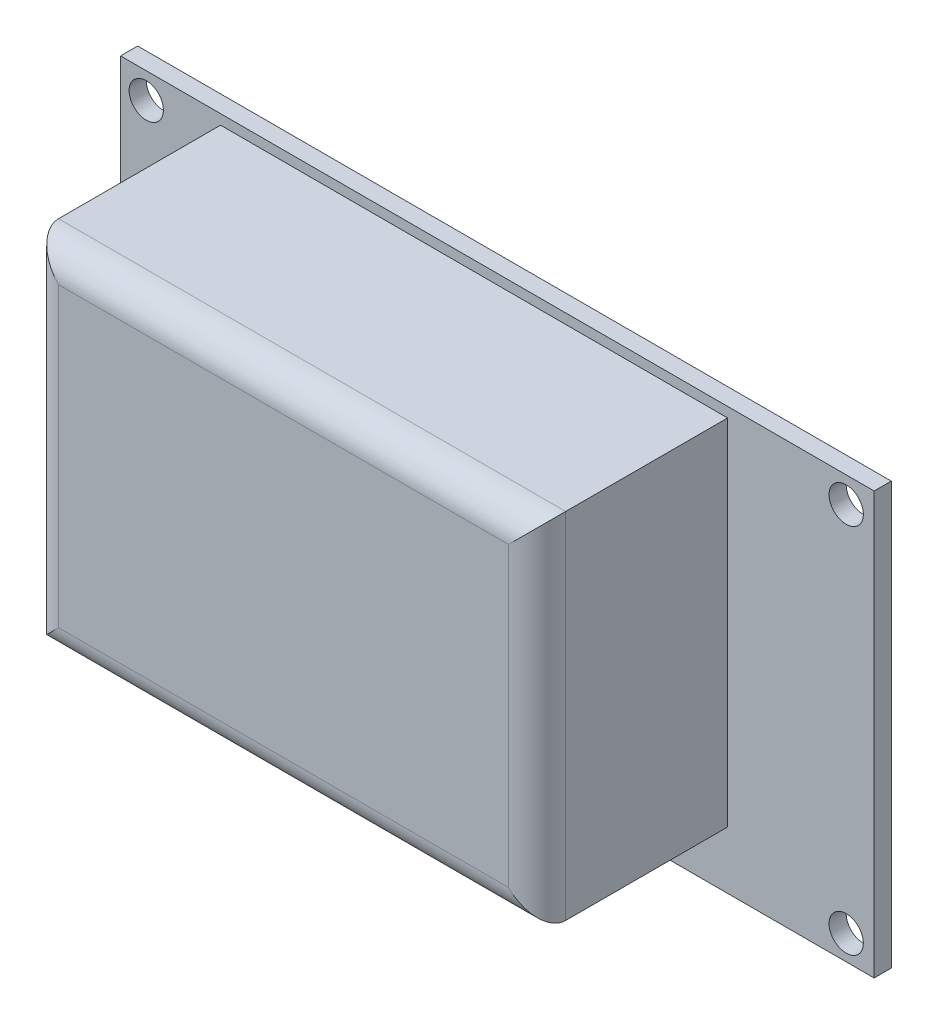
ISO-10303-21;
HEADER;
FILE_DESCRIPTION(('STEP AP214'),'2;1');
FILE_NAME('part.step','',(''),(''),'','','');
FILE_SCHEMA(('AUTOMOTIVE_DESIGN { 1 0 10303 214 1 1 1 1 }'));
ENDSEC;
DATA;
#1=APPLICATION_CONTEXT('core data for automotive mechanical design processes');
#2=APPLICATION_PROTOCOL_DEFINITION('international standard','automotive_design',2000,#1);
#3=PRODUCT_CONTEXT('',#1,'mechanical');
#4=PRODUCT('Part','Part','',(#3));
#5=PRODUCT_RELATED_PRODUCT_CATEGORY('part','',(#4));
#6=PRODUCT_DEFINITION_FORMATION('','',#4);
#7=PRODUCT_DEFINITION_CONTEXT('part definition',#1,'design');
#8=PRODUCT_DEFINITION('design','',#6,#7);
#9=PRODUCT_DEFINITION_SHAPE('','',#8);
#10=(LENGTH_UNIT() NAMED_UNIT(*) SI_UNIT(.MILLI.,.METRE.));
#11=(NAMED_UNIT(*) PLANE_ANGLE_UNIT() SI_UNIT($,.RADIAN.));
#12=(NAMED_UNIT(*) SI_UNIT($,.STERADIAN.) SOLID_ANGLE_UNIT());
#13=UNCERTAINTY_MEASURE_WITH_UNIT(LENGTH_MEASURE(1.E-05),#10,'distance_accuracy_value','');
#14=(GEOMETRIC_REPRESENTATION_CONTEXT(3) GLOBAL_UNCERTAINTY_ASSIGNED_CONTEXT((#13)) GLOBAL_UNIT_ASSIGNED_CONTEXT((#10,
#11,#12)) REPRESENTATION_CONTEXT('',''));
#15=CARTESIAN_POINT('',(0.,0.,0.));
#16=DIRECTION('',(0.,0.,1.));
#17=DIRECTION('',(1.,0.,0.));
#18=AXIS2_PLACEMENT_3D('',#15,#16,#17);
#19=CARTESIAN_POINT('',(-33.5000000052,18.749999965,1.524));
#20=DIRECTION('',(0.,0.,-1.));
#21=DIRECTION('',(-1.,0.,0.));
#22=AXIS2_PLACEMENT_3D('',#19,#20,#21);
#23=PLANE('',#22);
#24=CARTESIAN_POINT('',(-31.2140000052,16.463999965,1.524));
#25=DIRECTION('',(0.,0.,-1.));
#26=DIRECTION('',(-1.,0.,0.));
#27=AXIS2_PLACEMENT_3D('',#24,#25,#26);
#28=CIRCLE('',#27,1.52400000000001);
#29=CARTESIAN_POINT('',(-32.7380000052,16.463999965,1.524));
#30=VERTEX_POINT('',#29);
#31=EDGE_CURVE('E198',#30,#30,#28,.T.);
#32=ORIENTED_EDGE('',*,*,#31,.T.);
#33=EDGE_LOOP('',(#32));
#34=FACE_BOUND('',#33,.T.);
#35=CARTESIAN_POINT('',(31.0159999948,16.463999965,1.524));
#36=DIRECTION('',(0.,0.,-1.));
#37=DIRECTION('',(-1.,0.,0.));
#38=AXIS2_PLACEMENT_3D('',#35,#36,#37);
#39=CIRCLE('',#38,1.52400000000001);
#40=CARTESIAN_POINT('',(29.4919999948,16.463999965,1.524));
#41=VERTEX_POINT('',#40);
#42=EDGE_CURVE('E208',#41,#41,#39,.T.);
#43=ORIENTED_EDGE('',*,*,#42,.T.);
#44=EDGE_LOOP('',(#43));
#45=FACE_BOUND('',#44,.T.);
#46=CARTESIAN_POINT('',(-31.2140000052,-16.556000035,1.524));
#47=DIRECTION('',(0.,0.,-1.));
#48=DIRECTION('',(-1.,0.,0.));
#49=AXIS2_PLACEMENT_3D('',#46,#47,#48);
#50=CIRCLE('',#49,1.52400000000001);
#51=CARTESIAN_POINT('',(-32.7380000052,-16.556000035,1.524));
#52=VERTEX_POINT('',#51);
#53=EDGE_CURVE('E214',#52,#52,#50,.T.);
#54=ORIENTED_EDGE('',*,*,#53,.T.);
#55=EDGE_LOOP('',(#54));
#56=FACE_BOUND('',#55,.T.);
#57=CARTESIAN_POINT('',(31.0159999948,-16.556000035,1.524));
#58=DIRECTION('',(0.,0.,1.));
#59=DIRECTION('',(1.,0.,0.));
#60=AXIS2_PLACEMENT_3D('',#57,#58,#59);
#61=CIRCLE('',#60,1.52400000000001);
#62=CARTESIAN_POINT('',(32.5399999948,-16.556000035,1.524));
#63=VERTEX_POINT('',#62);
#64=EDGE_CURVE('E217',#63,#63,#61,.T.);
#65=ORIENTED_EDGE('',*,*,#64,.F.);
#66=EDGE_LOOP('',(#65));
#67=FACE_BOUND('',#66,.T.);
#68=DIRECTION('',(0.,1.,0.));
#69=VECTOR('',#68,1.);
#70=CARTESIAN_POINT('',(-33.5000000052,-18.749999965,1.524));
#71=LINE('',#70,#69);
#72=CARTESIAN_POINT('',(-33.5000000052,-18.749999965,1.524));
#73=VERTEX_POINT('',#72);
#74=CARTESIAN_POINT('',(-33.5000000052,18.749999965,1.524));
#75=VERTEX_POINT('',#74);
#76=EDGE_CURVE('E138',#73,#75,#71,.T.);
#77=ORIENTED_EDGE('',*,*,#76,.F.);
#78=DIRECTION('',(-1.,0.,0.));
#79=VECTOR('',#78,1.);
#80=CARTESIAN_POINT('',(33.5000000052,-18.749999965,1.524));
#81=LINE('',#80,#79);
#82=CARTESIAN_POINT('',(33.5000000052,-18.749999965,1.524));
#83=VERTEX_POINT('',#82);
#84=EDGE_CURVE('E148',#83,#73,#81,.T.);
#85=ORIENTED_EDGE('',*,*,#84,.F.);
#86=DIRECTION('',(0.,-1.,0.));
#87=VECTOR('',#86,1.);
#88=CARTESIAN_POINT('',(33.5000000052,18.749999965,1.524));
#89=LINE('',#88,#87);
#90=CARTESIAN_POINT('',(33.5000000052,18.749999965,1.524));
#91=VERTEX_POINT('',#90);
#92=EDGE_CURVE('E145',#91,#83,#89,.T.);
#93=ORIENTED_EDGE('',*,*,#92,.F.);
#94=DIRECTION('',(1.,0.,0.));
#95=VECTOR('',#94,1.);
#96=CARTESIAN_POINT('',(-33.5000000052,18.749999965,1.524));
#97=LINE('',#96,#95);
#98=EDGE_CURVE('E141',#75,#91,#97,.T.);
#99=ORIENTED_EDGE('',*,*,#98,.F.);
#100=EDGE_LOOP('',(#77,#85,#93,#99));
#101=FACE_BOUND('',#100,.T.);
#102=DIRECTION('',(0.,1.,0.));
#103=VECTOR('',#102,1.);
#104=CARTESIAN_POINT('',(20.4749999981446,17.8609999622899,1.524));
#105=LINE('',#104,#103);
#106=CARTESIAN_POINT('',(20.4749999981446,-13.635000038637,1.524));
#107=VERTEX_POINT('',#106);
#108=CARTESIAN_POINT('',(20.4749999981446,17.8609999622899,1.524));
#109=VERTEX_POINT('',#108);
#110=EDGE_CURVE('E109',#107,#109,#105,.T.);
#111=ORIENTED_EDGE('',*,*,#110,.F.);
#112=DIRECTION('',(1.,0.,0.));
#113=VECTOR('',#112,1.);
#114=CARTESIAN_POINT('',(20.4749999981446,-13.635000038637,1.524));
#115=LINE('',#114,#113);
#116=CARTESIAN_POINT('',(-24.610000007605,-13.635000038637,1.524));
#117=VERTEX_POINT('',#116);
#118=EDGE_CURVE('E114',#117,#107,#115,.T.);
#119=ORIENTED_EDGE('',*,*,#118,.F.);
#120=DIRECTION('',(0.,-1.,0.));
#121=VECTOR('',#120,1.);
#122=CARTESIAN_POINT('',(-24.610000007605,-13.635000038637,1.524));
#123=LINE('',#122,#121);
#124=CARTESIAN_POINT('',(-24.610000007605,17.8609999622899,1.524));
#125=VERTEX_POINT('',#124);
#126=EDGE_CURVE('E127',#125,#117,#123,.T.);
#127=ORIENTED_EDGE('',*,*,#126,.F.);
#128=DIRECTION('',(-1.,0.,0.));
#129=VECTOR('',#128,1.);
#130=CARTESIAN_POINT('',(-24.610000007605,17.8609999622899,1.524));
#131=LINE('',#130,#129);
#132=EDGE_CURVE('E122',#109,#125,#131,.T.);
#133=ORIENTED_EDGE('',*,*,#132,.F.);
#134=EDGE_LOOP('',(#111,#119,#127,#133));
#135=FACE_BOUND('',#134,.T.);
#136=ADVANCED_FACE('F31',(#34,#45,#56,#67,#101,#135),#23,.F.);
#137=CARTESIAN_POINT('',(-33.5000000052,-18.749999965,1.524));
#138=DIRECTION('',(-1.,0.,0.));
#139=DIRECTION('',(0.,0.,1.));
#140=AXIS2_PLACEMENT_3D('',#137,#138,#139);
#141=PLANE('',#140);
#142=DIRECTION('',(0.,1.,0.));
#143=VECTOR('',#142,1.);
#144=CARTESIAN_POINT('',(-33.5000000052,-18.749999965,0.));
#145=LINE('',#144,#143);
#146=CARTESIAN_POINT('',(-33.5000000052,-18.749999965,0.));
#147=VERTEX_POINT('',#146);
#148=CARTESIAN_POINT('',(-33.5000000052,18.749999965,0.));
#149=VERTEX_POINT('',#148);
#150=EDGE_CURVE('E137',#147,#149,#145,.T.);
#151=ORIENTED_EDGE('',*,*,#150,.F.);
#152=DIRECTION('',(0.,0.,-1.));
#153=VECTOR('',#152,1.);
#154=CARTESIAN_POINT('',(-33.5000000052,-18.749999965,1.524));
#155=LINE('',#154,#153);
#156=EDGE_CURVE('E162',#73,#147,#155,.T.);
#157=ORIENTED_EDGE('',*,*,#156,.F.);
#158=ORIENTED_EDGE('',*,*,#76,.T.);
#159=DIRECTION('',(0.,0.,-1.));
#160=VECTOR('',#159,1.);
#161=CARTESIAN_POINT('',(-33.5000000052,18.749999965,1.524));
#162=LINE('',#161,#160);
#163=EDGE_CURVE('E151',#75,#149,#162,.T.);
#164=ORIENTED_EDGE('',*,*,#163,.T.);
#165=EDGE_LOOP('',(#151,#157,#158,#164));
#166=FACE_BOUND('',#165,.T.);
#167=ADVANCED_FACE('F242',(#166),#141,.T.);
#168=CARTESIAN_POINT('',(33.5000000052,-18.749999965,1.524));
#169=DIRECTION('',(0.,-1.,0.));
#170=DIRECTION('',(0.,0.,-1.));
#171=AXIS2_PLACEMENT_3D('',#168,#169,#170);
#172=PLANE('',#171);
#173=DIRECTION('',(-1.,0.,0.));
#174=VECTOR('',#173,1.);
#175=CARTESIAN_POINT('',(33.5000000052,-18.749999965,0.));
#176=LINE('',#175,#174);
#177=CARTESIAN_POINT('',(33.5000000052,-18.749999965,0.));
#178=VERTEX_POINT('',#177);
#179=EDGE_CURVE('E142',#178,#147,#176,.T.);
#180=ORIENTED_EDGE('',*,*,#179,.F.);
#181=DIRECTION('',(0.,0.,-1.));
#182=VECTOR('',#181,1.);
#183=CARTESIAN_POINT('',(33.5000000052,-18.749999965,1.524));
#184=LINE('',#183,#182);
#185=EDGE_CURVE('E165',#83,#178,#184,.T.);
#186=ORIENTED_EDGE('',*,*,#185,.F.);
#187=ORIENTED_EDGE('',*,*,#84,.T.);
#188=ORIENTED_EDGE('',*,*,#156,.T.);
#189=EDGE_LOOP('',(#180,#186,#187,#188));
#190=FACE_BOUND('',#189,.T.);
#191=ADVANCED_FACE('F248',(#190),#172,.T.);
#192=CARTESIAN_POINT('',(33.5000000052,18.749999965,1.524));
#193=DIRECTION('',(1.,0.,0.));
#194=DIRECTION('',(0.,0.,-1.));
#195=AXIS2_PLACEMENT_3D('',#192,#193,#194);
#196=PLANE('',#195);
#197=DIRECTION('',(0.,-1.,0.));
#198=VECTOR('',#197,1.);
#199=CARTESIAN_POINT('',(33.5000000052,18.749999965,0.));
#200=LINE('',#199,#198);
#201=CARTESIAN_POINT('',(33.5000000052,18.749999965,0.));
#202=VERTEX_POINT('',#201);
#203=EDGE_CURVE('E157',#202,#178,#200,.T.);
#204=ORIENTED_EDGE('',*,*,#203,.F.);
#205=DIRECTION('',(0.,0.,-1.));
#206=VECTOR('',#205,1.);
#207=CARTESIAN_POINT('',(33.5000000052,18.749999965,1.524));
#208=LINE('',#207,#206);
#209=EDGE_CURVE('E167',#91,#202,#208,.T.);
#210=ORIENTED_EDGE('',*,*,#209,.F.);
#211=ORIENTED_EDGE('',*,*,#92,.T.);
#212=ORIENTED_EDGE('',*,*,#185,.T.);
#213=EDGE_LOOP('',(#204,#210,#211,#212));
#214=FACE_BOUND('',#213,.T.);
#215=ADVANCED_FACE('F262',(#214),#196,.T.);
#216=CARTESIAN_POINT('',(-33.5000000052,18.749999965,1.524));
#217=DIRECTION('',(0.,1.,0.));
#218=DIRECTION('',(0.,0.,1.));
#219=AXIS2_PLACEMENT_3D('',#216,#217,#218);
#220=PLANE('',#219);
#221=DIRECTION('',(1.,0.,0.));
#222=VECTOR('',#221,1.);
#223=CARTESIAN_POINT('',(-33.5000000052,18.749999965,0.));
#224=LINE('',#223,#222);
#225=EDGE_CURVE('E154',#149,#202,#224,.T.);
#226=ORIENTED_EDGE('',*,*,#225,.F.);
#227=ORIENTED_EDGE('',*,*,#163,.F.);
#228=ORIENTED_EDGE('',*,*,#98,.T.);
#229=ORIENTED_EDGE('',*,*,#209,.T.);
#230=EDGE_LOOP('',(#226,#227,#228,#229));
#231=FACE_BOUND('',#230,.T.);
#232=ADVANCED_FACE('F258',(#231),#220,.T.);
#233=CARTESIAN_POINT('',(-33.5000000052,18.749999965,0.));
#234=DIRECTION('',(0.,0.,-1.));
#235=DIRECTION('',(-1.,0.,0.));
#236=AXIS2_PLACEMENT_3D('',#233,#234,#235);
#237=PLANE('',#236);
#238=CARTESIAN_POINT('',(-31.2140000052,16.463999965,0.));
#239=DIRECTION('',(0.,0.,-1.));
#240=DIRECTION('',(-1.,0.,0.));
#241=AXIS2_PLACEMENT_3D('',#238,#239,#240);
#242=CIRCLE('',#241,1.52400000000001);
#243=CARTESIAN_POINT('',(-32.7380000052,16.463999965,0.));
#244=VERTEX_POINT('',#243);
#245=EDGE_CURVE('E193',#244,#244,#242,.T.);
#246=ORIENTED_EDGE('',*,*,#245,.F.);
#247=EDGE_LOOP('',(#246));
#248=FACE_BOUND('',#247,.T.);
#249=CARTESIAN_POINT('',(31.0159999948,16.463999965,0.));
#250=DIRECTION('',(0.,0.,-1.));
#251=DIRECTION('',(-1.,0.,0.));
#252=AXIS2_PLACEMENT_3D('',#249,#250,#251);
#253=CIRCLE('',#252,1.52400000000001);
#254=CARTESIAN_POINT('',(29.4919999948,16.463999965,0.));
#255=VERTEX_POINT('',#254);
#256=EDGE_CURVE('E203',#255,#255,#253,.T.);
#257=ORIENTED_EDGE('',*,*,#256,.F.);
#258=EDGE_LOOP('',(#257));
#259=FACE_BOUND('',#258,.T.);
#260=CARTESIAN_POINT('',(-31.2140000052,-16.556000035,0.));
#261=DIRECTION('',(0.,0.,-1.));
#262=DIRECTION('',(-1.,0.,0.));
#263=AXIS2_PLACEMENT_3D('',#260,#261,#262);
#264=CIRCLE('',#263,1.52400000000001);
#265=CARTESIAN_POINT('',(-32.7380000052,-16.556000035,0.));
#266=VERTEX_POINT('',#265);
#267=EDGE_CURVE('E211',#266,#266,#264,.T.);
#268=ORIENTED_EDGE('',*,*,#267,.F.);
#269=EDGE_LOOP('',(#268));
#270=FACE_BOUND('',#269,.T.);
#271=CARTESIAN_POINT('',(31.0159999948,-16.556000035,0.));
#272=DIRECTION('',(0.,0.,1.));
#273=DIRECTION('',(1.,0.,0.));
#274=AXIS2_PLACEMENT_3D('',#271,#272,#273);
#275=CIRCLE('',#274,1.52400000000001);
#276=CARTESIAN_POINT('',(32.5399999948,-16.556000035,0.));
#277=VERTEX_POINT('',#276);
#278=EDGE_CURVE('E123',#277,#277,#275,.T.);
#279=ORIENTED_EDGE('',*,*,#278,.T.);
#280=EDGE_LOOP('',(#279));
#281=FACE_BOUND('',#280,.T.);
#282=ORIENTED_EDGE('',*,*,#150,.T.);
#283=ORIENTED_EDGE('',*,*,#225,.T.);
#284=ORIENTED_EDGE('',*,*,#203,.T.);
#285=ORIENTED_EDGE('',*,*,#179,.T.);
#286=EDGE_LOOP('',(#282,#283,#284,#285));
#287=FACE_BOUND('',#286,.T.);
#288=ADVANCED_FACE('F255',(#248,#259,#270,#281,#287),#237,.T.);
#289=CARTESIAN_POINT('',(20.4749999981446,17.8609999622899,18.4658));
#290=DIRECTION('',(-1.,0.,0.));
#291=DIRECTION('',(0.,0.,1.));
#292=AXIS2_PLACEMENT_3D('',#289,#290,#291);
#293=PLANE('',#292);
#294=DIRECTION('',(0.,0.,-1.));
#295=VECTOR('',#294,1.);
#296=CARTESIAN_POINT('',(20.4749999981446,17.8609999622899,18.4658));
#297=LINE('',#296,#295);
#298=CARTESIAN_POINT('',(20.4749999981446,17.8609999622899,15.9258));
#299=VERTEX_POINT('',#298);
#300=EDGE_CURVE('E135',#299,#109,#297,.T.);
#301=ORIENTED_EDGE('',*,*,#300,.F.);
#302=DIRECTION('',(0.,1.,0.));
#303=VECTOR('',#302,1.);
#304=CARTESIAN_POINT('',(20.4749999981446,17.8609999622899,15.9258));
#305=LINE('',#304,#303);
#306=CARTESIAN_POINT('',(20.4749999981446,-13.635000038637,15.9258));
#307=VERTEX_POINT('',#306);
#308=EDGE_CURVE('E11',#299,#307,#305,.F.);
#309=ORIENTED_EDGE('',*,*,#308,.T.);
#310=DIRECTION('',(0.,0.,-1.));
#311=VECTOR('',#310,1.);
#312=CARTESIAN_POINT('',(20.4749999981446,-13.635000038637,18.4658));
#313=LINE('',#312,#311);
#314=EDGE_CURVE('E106',#307,#107,#313,.T.);
#315=ORIENTED_EDGE('',*,*,#314,.T.);
#316=ORIENTED_EDGE('',*,*,#110,.T.);
#317=EDGE_LOOP('',(#301,#309,#315,#316));
#318=FACE_BOUND('',#317,.T.);
#319=ADVANCED_FACE('F108',(#318),#293,.F.);
#320=CARTESIAN_POINT('',(-24.610000007605,17.8609999622899,18.4658));
#321=DIRECTION('',(0.,-1.,0.));
#322=DIRECTION('',(0.,0.,-1.));
#323=AXIS2_PLACEMENT_3D('',#320,#321,#322);
#324=PLANE('',#323);
#325=DIRECTION('',(0.,0.,-1.));
#326=VECTOR('',#325,1.);
#327=CARTESIAN_POINT('',(-24.610000007605,17.8609999622899,18.4658));
#328=LINE('',#327,#326);
#329=CARTESIAN_POINT('',(-24.610000007605,17.8609999622899,15.9258));
#330=VERTEX_POINT('',#329);
#331=EDGE_CURVE('E133',#330,#125,#328,.T.);
#332=ORIENTED_EDGE('',*,*,#331,.F.);
#333=DIRECTION('',(-1.,0.,0.));
#334=VECTOR('',#333,1.);
#335=CARTESIAN_POINT('',(-24.610000007605,17.8609999622899,15.9258));
#336=LINE('',#335,#334);
#337=EDGE_CURVE('E40',#330,#299,#336,.F.);
#338=ORIENTED_EDGE('',*,*,#337,.T.);
#339=ORIENTED_EDGE('',*,*,#300,.T.);
#340=ORIENTED_EDGE('',*,*,#132,.T.);
#341=EDGE_LOOP('',(#332,#338,#339,#340));
#342=FACE_BOUND('',#341,.T.);
#343=ADVANCED_FACE('F221',(#342),#324,.F.);
#344=CARTESIAN_POINT('',(-24.610000007605,-13.635000038637,18.4658));
#345=DIRECTION('',(1.,0.,0.));
#346=DIRECTION('',(0.,0.,-1.));
#347=AXIS2_PLACEMENT_3D('',#344,#345,#346);
#348=PLANE('',#347);
#349=DIRECTION('',(0.,0.,-1.));
#350=VECTOR('',#349,1.);
#351=CARTESIAN_POINT('',(-24.610000007605,-13.635000038637,18.4658));
#352=LINE('',#351,#350);
#353=CARTESIAN_POINT('',(-24.610000007605,-13.635000038637,15.9258));
#354=VERTEX_POINT('',#353);
#355=EDGE_CURVE('E113',#354,#117,#352,.T.);
#356=ORIENTED_EDGE('',*,*,#355,.F.);
#357=DIRECTION('',(0.,-1.,0.));
#358=VECTOR('',#357,1.);
#359=CARTESIAN_POINT('',(-24.610000007605,-13.635000038637,15.9258));
#360=LINE('',#359,#358);
#361=EDGE_CURVE('E178',#354,#330,#360,.F.);
#362=ORIENTED_EDGE('',*,*,#361,.T.);
#363=ORIENTED_EDGE('',*,*,#331,.T.);
#364=ORIENTED_EDGE('',*,*,#126,.T.);
#365=EDGE_LOOP('',(#356,#362,#363,#364));
#366=FACE_BOUND('',#365,.T.);
#367=ADVANCED_FACE('F228',(#366),#348,.F.);
#368=CARTESIAN_POINT('',(20.4749999981446,-13.635000038637,18.4658));
#369=DIRECTION('',(0.,1.,0.));
#370=DIRECTION('',(0.,0.,1.));
#371=AXIS2_PLACEMENT_3D('',#368,#369,#370);
#372=PLANE('',#371);
#373=ORIENTED_EDGE('',*,*,#314,.F.);
#374=DIRECTION('',(1.,0.,0.));
#375=VECTOR('',#374,1.);
#376=CARTESIAN_POINT('',(20.4749999981446,-13.635000038637,15.9258));
#377=LINE('',#376,#375);
#378=EDGE_CURVE('E181',#307,#354,#377,.F.);
#379=ORIENTED_EDGE('',*,*,#378,.T.);
#380=ORIENTED_EDGE('',*,*,#355,.T.);
#381=ORIENTED_EDGE('',*,*,#118,.T.);
#382=EDGE_LOOP('',(#373,#379,#380,#381));
#383=FACE_BOUND('',#382,.T.);
#384=ADVANCED_FACE('F125',(#383),#372,.F.);
#385=CARTESIAN_POINT('',(20.4749999981446,-13.635000038637,18.4658));
#386=DIRECTION('',(0.,0.,-1.));
#387=DIRECTION('',(-1.,0.,0.));
#388=AXIS2_PLACEMENT_3D('',#385,#386,#387);
#389=PLANE('',#388);
#390=DIRECTION('',(-1.,0.,0.));
#391=VECTOR('',#390,1.);
#392=CARTESIAN_POINT('',(20.4749999981446,15.3209999622899,18.4658));
#393=LINE('',#392,#391);
#394=CARTESIAN_POINT('',(17.9349999981446,15.3209999622899,18.4658));
#395=VERTEX_POINT('',#394);
#396=CARTESIAN_POINT('',(-22.070000007605,15.3209999622899,18.4658));
#397=VERTEX_POINT('',#396);
#398=EDGE_CURVE('E171',#395,#397,#393,.T.);
#399=ORIENTED_EDGE('',*,*,#398,.T.);
#400=DIRECTION('',(0.,-1.,0.));
#401=VECTOR('',#400,1.);
#402=CARTESIAN_POINT('',(-22.070000007605,-13.635000038637,18.4658));
#403=LINE('',#402,#401);
#404=CARTESIAN_POINT('',(-22.070000007605,-11.095000038637,18.4658));
#405=VERTEX_POINT('',#404);
#406=EDGE_CURVE('E175',#397,#405,#403,.T.);
#407=ORIENTED_EDGE('',*,*,#406,.T.);
#408=DIRECTION('',(1.,0.,0.));
#409=VECTOR('',#408,1.);
#410=CARTESIAN_POINT('',(20.4749999981446,-11.095000038637,18.4658));
#411=LINE('',#410,#409);
#412=CARTESIAN_POINT('',(17.9349999981446,-11.095000038637,18.4658));
#413=VERTEX_POINT('',#412);
#414=EDGE_CURVE('E173',#405,#413,#411,.T.);
#415=ORIENTED_EDGE('',*,*,#414,.T.);
#416=DIRECTION('',(0.,1.,0.));
#417=VECTOR('',#416,1.);
#418=CARTESIAN_POINT('',(17.9349999981446,-13.635000038637,18.4658));
#419=LINE('',#418,#417);
#420=EDGE_CURVE('E164',#413,#395,#419,.T.);
#421=ORIENTED_EDGE('',*,*,#420,.T.);
#422=EDGE_LOOP('',(#399,#407,#415,#421));
#423=FACE_BOUND('',#422,.T.);
#424=ADVANCED_FACE('F294',(#423),#389,.F.);
#425=CARTESIAN_POINT('',(31.0159999948,-16.556000035,1.524));
#426=DIRECTION('',(0.,0.,1.));
#427=DIRECTION('',(1.,0.,0.));
#428=AXIS2_PLACEMENT_3D('',#425,#426,#427);
#429=CYLINDRICAL_SURFACE('',#428,1.52400000000001);
#430=ORIENTED_EDGE('',*,*,#278,.F.);
#431=EDGE_LOOP('',(#430));
#432=FACE_BOUND('',#431,.T.);
#433=ORIENTED_EDGE('',*,*,#64,.T.);
#434=EDGE_LOOP('',(#433));
#435=FACE_BOUND('',#434,.T.);
#436=ADVANCED_FACE('F299',(#432,#435),#429,.F.);
#437=CARTESIAN_POINT('',(-31.2140000052,-16.556000035,0.));
#438=DIRECTION('',(0.,0.,-1.));
#439=DIRECTION('',(-1.,0.,0.));
#440=AXIS2_PLACEMENT_3D('',#437,#438,#439);
#441=CYLINDRICAL_SURFACE('',#440,1.52400000000001);
#442=ORIENTED_EDGE('',*,*,#267,.T.);
#443=EDGE_LOOP('',(#442));
#444=FACE_BOUND('',#443,.T.);
#445=ORIENTED_EDGE('',*,*,#53,.F.);
#446=EDGE_LOOP('',(#445));
#447=FACE_BOUND('',#446,.T.);
#448=ADVANCED_FACE('F359',(#444,#447),#441,.F.);
#449=CARTESIAN_POINT('',(31.0159999948,16.463999965,0.));
#450=DIRECTION('',(0.,0.,-1.));
#451=DIRECTION('',(-1.,0.,0.));
#452=AXIS2_PLACEMENT_3D('',#449,#450,#451);
#453=CYLINDRICAL_SURFACE('',#452,1.52400000000001);
#454=ORIENTED_EDGE('',*,*,#256,.T.);
#455=EDGE_LOOP('',(#454));
#456=FACE_BOUND('',#455,.T.);
#457=ORIENTED_EDGE('',*,*,#42,.F.);
#458=EDGE_LOOP('',(#457));
#459=FACE_BOUND('',#458,.T.);
#460=ADVANCED_FACE('F340',(#456,#459),#453,.F.);
#461=CARTESIAN_POINT('',(-31.2140000052,16.463999965,0.));
#462=DIRECTION('',(0.,0.,-1.));
#463=DIRECTION('',(-1.,0.,0.));
#464=AXIS2_PLACEMENT_3D('',#461,#462,#463);
#465=CYLINDRICAL_SURFACE('',#464,1.52400000000001);
#466=ORIENTED_EDGE('',*,*,#245,.T.);
#467=EDGE_LOOP('',(#466));
#468=FACE_BOUND('',#467,.T.);
#469=ORIENTED_EDGE('',*,*,#31,.F.);
#470=EDGE_LOOP('',(#469));
#471=FACE_BOUND('',#470,.T.);
#472=ADVANCED_FACE('F240',(#468,#471),#465,.F.);
#473=CARTESIAN_POINT('',(17.9349999981446,-13.635000038637,15.9258));
#474=DIRECTION('',(0.,1.,0.));
#475=DIRECTION('',(0.,0.,1.));
#476=AXIS2_PLACEMENT_3D('',#473,#474,#475);
#477=CYLINDRICAL_SURFACE('',#476,2.54);
#478=CARTESIAN_POINT('',(17.9349999981446,-11.095000038637,15.9258));
#479=DIRECTION('',(0.707106781186547,0.707106781186547,0.));
#480=DIRECTION('',(-0.707106781186547,0.707106781186547,0.));
#481=AXIS2_PLACEMENT_3D('',#478,#479,#480);
#482=ELLIPSE('',#481,3.59210244842766,2.54);
#483=EDGE_CURVE('E187',#307,#413,#482,.F.);
#484=ORIENTED_EDGE('',*,*,#483,.F.);
#485=ORIENTED_EDGE('',*,*,#308,.F.);
#486=CARTESIAN_POINT('',(17.9349999981446,15.3209999622899,15.9258));
#487=DIRECTION('',(-0.707106781186547,0.707106781186547,0.));
#488=DIRECTION('',(0.707106781186547,0.707106781186547,0.));
#489=AXIS2_PLACEMENT_3D('',#486,#487,#488);
#490=ELLIPSE('',#489,3.59210244842766,2.54);
#491=EDGE_CURVE('E35',#395,#299,#490,.T.);
#492=ORIENTED_EDGE('',*,*,#491,.F.);
#493=ORIENTED_EDGE('',*,*,#420,.F.);
#494=EDGE_LOOP('',(#484,#485,#492,#493));
#495=FACE_BOUND('',#494,.T.);
#496=ADVANCED_FACE('F33',(#495),#477,.T.);
#497=CARTESIAN_POINT('',(20.4749999981446,15.3209999622899,15.9258));
#498=DIRECTION('',(-1.,0.,0.));
#499=DIRECTION('',(0.,0.,1.));
#500=AXIS2_PLACEMENT_3D('',#497,#498,#499);
#501=CYLINDRICAL_SURFACE('',#500,2.54);
#502=ORIENTED_EDGE('',*,*,#491,.T.);
#503=ORIENTED_EDGE('',*,*,#337,.F.);
#504=CARTESIAN_POINT('',(-22.070000007605,15.3209999622899,15.9258));
#505=DIRECTION('',(-0.707106781186547,-0.707106781186547,0.));
#506=DIRECTION('',(-0.707106781186547,0.707106781186547,0.));
#507=AXIS2_PLACEMENT_3D('',#504,#505,#506);
#508=ELLIPSE('',#507,3.59210244842766,2.54);
#509=EDGE_CURVE('E186',#397,#330,#508,.T.);
#510=ORIENTED_EDGE('',*,*,#509,.F.);
#511=ORIENTED_EDGE('',*,*,#398,.F.);
#512=EDGE_LOOP('',(#502,#503,#510,#511));
#513=FACE_BOUND('',#512,.T.);
#514=ADVANCED_FACE('F233',(#513),#501,.T.);
#515=CARTESIAN_POINT('',(20.4749999981446,-11.095000038637,15.9258));
#516=DIRECTION('',(1.,0.,0.));
#517=DIRECTION('',(0.,0.,-1.));
#518=AXIS2_PLACEMENT_3D('',#515,#516,#517);
#519=CYLINDRICAL_SURFACE('',#518,2.54);
#520=ORIENTED_EDGE('',*,*,#483,.T.);
#521=ORIENTED_EDGE('',*,*,#414,.F.);
#522=CARTESIAN_POINT('',(-22.070000007605,-11.095000038637,15.9258));
#523=DIRECTION('',(0.707106781186547,-0.707106781186547,0.));
#524=DIRECTION('',(0.707106781186547,0.707106781186547,0.));
#525=AXIS2_PLACEMENT_3D('',#522,#523,#524);
#526=ELLIPSE('',#525,3.59210244842766,2.54);
#527=EDGE_CURVE('E184',#354,#405,#526,.F.);
#528=ORIENTED_EDGE('',*,*,#527,.F.);
#529=ORIENTED_EDGE('',*,*,#378,.F.);
#530=EDGE_LOOP('',(#520,#521,#528,#529));
#531=FACE_BOUND('',#530,.T.);
#532=ADVANCED_FACE('F225',(#531),#519,.T.);
#533=CARTESIAN_POINT('',(-22.070000007605,-13.635000038637,15.9258));
#534=DIRECTION('',(0.,-1.,0.));
#535=DIRECTION('',(0.,0.,-1.));
#536=AXIS2_PLACEMENT_3D('',#533,#534,#535);
#537=CYLINDRICAL_SURFACE('',#536,2.54);
#538=ORIENTED_EDGE('',*,*,#509,.T.);
#539=ORIENTED_EDGE('',*,*,#361,.F.);
#540=ORIENTED_EDGE('',*,*,#527,.T.);
#541=ORIENTED_EDGE('',*,*,#406,.F.);
#542=EDGE_LOOP('',(#538,#539,#540,#541));
#543=FACE_BOUND('',#542,.T.);
#544=ADVANCED_FACE('F230',(#543),#537,.T.);
#545=CLOSED_SHELL('',(#136,#167,#191,#215,#232,#288,#319,#343,#367,#384,#424,#436,#448,#460,
#472,#496,#514,#532,#544));
#546=MANIFOLD_SOLID_BREP('B2',#545);
#547=ADVANCED_BREP_SHAPE_REPRESENTATION('',(#18,#546),#14);
#548=SHAPE_DEFINITION_REPRESENTATION(#9,#547);
ENDSEC;
END-ISO-10303-21;
